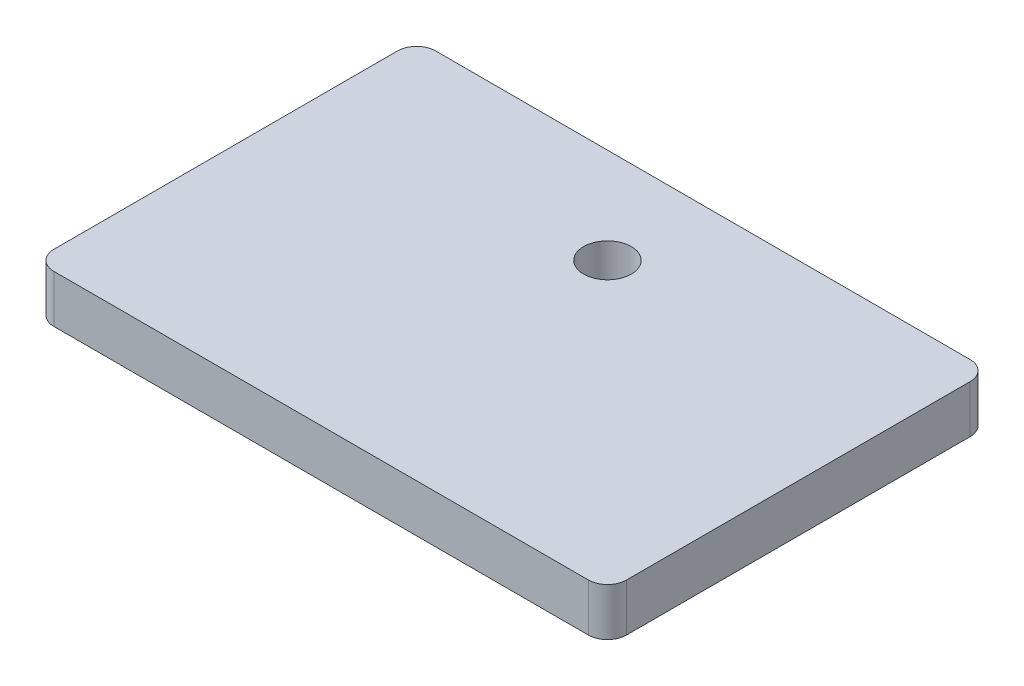
ISO-10303-21;
HEADER;
FILE_DESCRIPTION(('STEP AP214'),'2;1');
FILE_NAME('part.step','',(''),(''),'','','');
FILE_SCHEMA(('AUTOMOTIVE_DESIGN { 1 0 10303 214 1 1 1 1 }'));
ENDSEC;
DATA;
#1=APPLICATION_CONTEXT('core data for automotive mechanical design processes');
#2=APPLICATION_PROTOCOL_DEFINITION('international standard','automotive_design',2000,#1);
#3=PRODUCT_CONTEXT('',#1,'mechanical');
#4=PRODUCT('Part','Part','',(#3));
#5=PRODUCT_RELATED_PRODUCT_CATEGORY('part','',(#4));
#6=PRODUCT_DEFINITION_FORMATION('','',#4);
#7=PRODUCT_DEFINITION_CONTEXT('part definition',#1,'design');
#8=PRODUCT_DEFINITION('design','',#6,#7);
#9=PRODUCT_DEFINITION_SHAPE('','',#8);
#10=(LENGTH_UNIT() NAMED_UNIT(*) SI_UNIT(.MILLI.,.METRE.));
#11=(NAMED_UNIT(*) PLANE_ANGLE_UNIT() SI_UNIT($,.RADIAN.));
#12=(NAMED_UNIT(*) SI_UNIT($,.STERADIAN.) SOLID_ANGLE_UNIT());
#13=UNCERTAINTY_MEASURE_WITH_UNIT(LENGTH_MEASURE(1.E-05),#10,'distance_accuracy_value','');
#14=(GEOMETRIC_REPRESENTATION_CONTEXT(3) GLOBAL_UNCERTAINTY_ASSIGNED_CONTEXT((#13)) GLOBAL_UNIT_ASSIGNED_CONTEXT((#10,
#11,#12)) REPRESENTATION_CONTEXT('',''));
#15=CARTESIAN_POINT('',(0.,0.,0.));
#16=DIRECTION('',(0.,0.,1.));
#17=DIRECTION('',(1.,0.,0.));
#18=AXIS2_PLACEMENT_3D('',#15,#16,#17);
#19=CARTESIAN_POINT('',(38.1,6.35,25.4));
#20=DIRECTION('',(-1.,0.,0.));
#21=DIRECTION('',(0.,0.,1.));
#22=AXIS2_PLACEMENT_3D('',#19,#20,#21);
#23=PLANE('',#22);
#24=DIRECTION('',(0.,0.,-1.));
#25=VECTOR('',#24,1.);
#26=CARTESIAN_POINT('',(38.1,0.,25.4));
#27=LINE('',#26,#25);
#28=CARTESIAN_POINT('',(38.1,0.,22.86));
#29=VERTEX_POINT('',#28);
#30=CARTESIAN_POINT('',(38.1,0.,-22.86));
#31=VERTEX_POINT('',#30);
#32=EDGE_CURVE('E139',#29,#31,#27,.T.);
#33=ORIENTED_EDGE('',*,*,#32,.T.);
#34=DIRECTION('',(0.,-1.,0.));
#35=VECTOR('',#34,1.);
#36=CARTESIAN_POINT('',(38.1,6.35,-22.86));
#37=LINE('',#36,#35);
#38=CARTESIAN_POINT('',(38.1,6.35,-22.86));
#39=VERTEX_POINT('',#38);
#40=EDGE_CURVE('E173',#31,#39,#37,.F.);
#41=ORIENTED_EDGE('',*,*,#40,.T.);
#42=DIRECTION('',(0.,0.,-1.));
#43=VECTOR('',#42,1.);
#44=CARTESIAN_POINT('',(38.1,6.35,25.4));
#45=LINE('',#44,#43);
#46=CARTESIAN_POINT('',(38.1,6.35,22.86));
#47=VERTEX_POINT('',#46);
#48=EDGE_CURVE('E137',#47,#39,#45,.T.);
#49=ORIENTED_EDGE('',*,*,#48,.F.);
#50=DIRECTION('',(0.,-1.,0.));
#51=VECTOR('',#50,1.);
#52=CARTESIAN_POINT('',(38.1,6.35,22.86));
#53=LINE('',#52,#51);
#54=EDGE_CURVE('E169',#47,#29,#53,.T.);
#55=ORIENTED_EDGE('',*,*,#54,.T.);
#56=EDGE_LOOP('',(#33,#41,#49,#55));
#57=FACE_BOUND('',#56,.T.);
#58=ADVANCED_FACE('F38',(#57),#23,.F.);
#59=CARTESIAN_POINT('',(-38.1,6.35,-25.4));
#60=DIRECTION('',(0.,0.,1.));
#61=DIRECTION('',(1.,0.,0.));
#62=AXIS2_PLACEMENT_3D('',#59,#60,#61);
#63=PLANE('',#62);
#64=DIRECTION('',(-1.,0.,0.));
#65=VECTOR('',#64,1.);
#66=CARTESIAN_POINT('',(-38.1,0.,-25.4));
#67=LINE('',#66,#65);
#68=CARTESIAN_POINT('',(35.56,0.,-25.4));
#69=VERTEX_POINT('',#68);
#70=CARTESIAN_POINT('',(-35.56,0.,-25.4));
#71=VERTEX_POINT('',#70);
#72=EDGE_CURVE('E133',#69,#71,#67,.T.);
#73=ORIENTED_EDGE('',*,*,#72,.T.);
#74=DIRECTION('',(0.,-1.,0.));
#75=VECTOR('',#74,1.);
#76=CARTESIAN_POINT('',(-35.56,6.35,-25.4));
#77=LINE('',#76,#75);
#78=CARTESIAN_POINT('',(-35.56,6.35,-25.4));
#79=VERTEX_POINT('',#78);
#80=EDGE_CURVE('E109',#71,#79,#77,.F.);
#81=ORIENTED_EDGE('',*,*,#80,.T.);
#82=DIRECTION('',(-1.,0.,0.));
#83=VECTOR('',#82,1.);
#84=CARTESIAN_POINT('',(-38.1,6.35,-25.4));
#85=LINE('',#84,#83);
#86=CARTESIAN_POINT('',(35.56,6.35,-25.4));
#87=VERTEX_POINT('',#86);
#88=EDGE_CURVE('E192',#87,#79,#85,.T.);
#89=ORIENTED_EDGE('',*,*,#88,.F.);
#90=DIRECTION('',(0.,-1.,0.));
#91=VECTOR('',#90,1.);
#92=CARTESIAN_POINT('',(35.56,6.35,-25.4));
#93=LINE('',#92,#91);
#94=EDGE_CURVE('E115',#87,#69,#93,.T.);
#95=ORIENTED_EDGE('',*,*,#94,.T.);
#96=EDGE_LOOP('',(#73,#81,#89,#95));
#97=FACE_BOUND('',#96,.T.);
#98=ADVANCED_FACE('F222',(#97),#63,.F.);
#99=CARTESIAN_POINT('',(-38.1,6.35,25.4));
#100=DIRECTION('',(1.,0.,0.));
#101=DIRECTION('',(0.,0.,-1.));
#102=AXIS2_PLACEMENT_3D('',#99,#100,#101);
#103=PLANE('',#102);
#104=DIRECTION('',(0.,0.,1.));
#105=VECTOR('',#104,1.);
#106=CARTESIAN_POINT('',(-38.1,6.35,25.4));
#107=LINE('',#106,#105);
#108=CARTESIAN_POINT('',(-38.1,6.35,-22.86));
#109=VERTEX_POINT('',#108);
#110=CARTESIAN_POINT('',(-38.1,6.35,22.86));
#111=VERTEX_POINT('',#110);
#112=EDGE_CURVE('E124',#109,#111,#107,.T.);
#113=ORIENTED_EDGE('',*,*,#112,.F.);
#114=DIRECTION('',(0.,-1.,0.));
#115=VECTOR('',#114,1.);
#116=CARTESIAN_POINT('',(-38.1,6.35,-22.86));
#117=LINE('',#116,#115);
#118=CARTESIAN_POINT('',(-38.1,0.,-22.86));
#119=VERTEX_POINT('',#118);
#120=EDGE_CURVE('E108',#109,#119,#117,.T.);
#121=ORIENTED_EDGE('',*,*,#120,.T.);
#122=DIRECTION('',(0.,0.,1.));
#123=VECTOR('',#122,1.);
#124=CARTESIAN_POINT('',(-38.1,0.,25.4));
#125=LINE('',#124,#123);
#126=CARTESIAN_POINT('',(-38.1,0.,22.86));
#127=VERTEX_POINT('',#126);
#128=EDGE_CURVE('E122',#119,#127,#125,.T.);
#129=ORIENTED_EDGE('',*,*,#128,.T.);
#130=DIRECTION('',(0.,-1.,0.));
#131=VECTOR('',#130,1.);
#132=CARTESIAN_POINT('',(-38.1,6.35,22.86));
#133=LINE('',#132,#131);
#134=EDGE_CURVE('E127',#127,#111,#133,.F.);
#135=ORIENTED_EDGE('',*,*,#134,.T.);
#136=EDGE_LOOP('',(#113,#121,#129,#135));
#137=FACE_BOUND('',#136,.T.);
#138=ADVANCED_FACE('F121',(#137),#103,.F.);
#139=CARTESIAN_POINT('',(-38.1,6.35,25.4));
#140=DIRECTION('',(0.,0.,-1.));
#141=DIRECTION('',(-1.,0.,0.));
#142=AXIS2_PLACEMENT_3D('',#139,#140,#141);
#143=PLANE('',#142);
#144=DIRECTION('',(1.,0.,0.));
#145=VECTOR('',#144,1.);
#146=CARTESIAN_POINT('',(-38.1,0.,25.4));
#147=LINE('',#146,#145);
#148=CARTESIAN_POINT('',(-35.56,0.,25.4));
#149=VERTEX_POINT('',#148);
#150=CARTESIAN_POINT('',(35.56,0.,25.4));
#151=VERTEX_POINT('',#150);
#152=EDGE_CURVE('E132',#149,#151,#147,.T.);
#153=ORIENTED_EDGE('',*,*,#152,.T.);
#154=DIRECTION('',(0.,-1.,0.));
#155=VECTOR('',#154,1.);
#156=CARTESIAN_POINT('',(35.56,6.35,25.4));
#157=LINE('',#156,#155);
#158=CARTESIAN_POINT('',(35.56,6.35,25.4));
#159=VERTEX_POINT('',#158);
#160=EDGE_CURVE('E11',#151,#159,#157,.F.);
#161=ORIENTED_EDGE('',*,*,#160,.T.);
#162=DIRECTION('',(1.,0.,0.));
#163=VECTOR('',#162,1.);
#164=CARTESIAN_POINT('',(-38.1,6.35,25.4));
#165=LINE('',#164,#163);
#166=CARTESIAN_POINT('',(-35.56,6.35,25.4));
#167=VERTEX_POINT('',#166);
#168=EDGE_CURVE('E144',#167,#159,#165,.T.);
#169=ORIENTED_EDGE('',*,*,#168,.F.);
#170=DIRECTION('',(0.,-1.,0.));
#171=VECTOR('',#170,1.);
#172=CARTESIAN_POINT('',(-35.56,6.35,25.4));
#173=LINE('',#172,#171);
#174=EDGE_CURVE('E47',#167,#149,#173,.T.);
#175=ORIENTED_EDGE('',*,*,#174,.T.);
#176=EDGE_LOOP('',(#153,#161,#169,#175));
#177=FACE_BOUND('',#176,.T.);
#178=ADVANCED_FACE('F178',(#177),#143,.F.);
#179=CARTESIAN_POINT('',(0.,6.35,0.));
#180=DIRECTION('',(0.,-1.,0.));
#181=DIRECTION('',(0.,0.,-1.));
#182=AXIS2_PLACEMENT_3D('',#179,#180,#181);
#183=PLANE('',#182);
#184=CARTESIAN_POINT('',(0.,6.35,-12.7));
#185=DIRECTION('',(0.,1.,0.));
#186=DIRECTION('',(0.,0.,1.));
#187=AXIS2_PLACEMENT_3D('',#184,#185,#186);
#188=CIRCLE('',#187,3.175);
#189=CARTESIAN_POINT('',(0.,6.35,-9.52500000000001));
#190=VERTEX_POINT('',#189);
#191=EDGE_CURVE('E198',#190,#190,#188,.T.);
#192=ORIENTED_EDGE('',*,*,#191,.F.);
#193=EDGE_LOOP('',(#192));
#194=FACE_BOUND('',#193,.T.);
#195=ORIENTED_EDGE('',*,*,#88,.T.);
#196=CARTESIAN_POINT('',(-35.56,6.35,-22.86));
#197=DIRECTION('',(0.,-1.,0.));
#198=DIRECTION('',(0.,0.,-1.));
#199=AXIS2_PLACEMENT_3D('',#196,#197,#198);
#200=CIRCLE('',#199,2.54);
#201=EDGE_CURVE('E166',#79,#109,#200,.F.);
#202=ORIENTED_EDGE('',*,*,#201,.T.);
#203=ORIENTED_EDGE('',*,*,#112,.T.);
#204=CARTESIAN_POINT('',(-35.56,6.35,22.86));
#205=DIRECTION('',(0.,-1.,0.));
#206=DIRECTION('',(0.,0.,-1.));
#207=AXIS2_PLACEMENT_3D('',#204,#205,#206);
#208=CIRCLE('',#207,2.54);
#209=EDGE_CURVE('E59',#111,#167,#208,.F.);
#210=ORIENTED_EDGE('',*,*,#209,.T.);
#211=ORIENTED_EDGE('',*,*,#168,.T.);
#212=CARTESIAN_POINT('',(35.56,6.35,22.86));
#213=DIRECTION('',(0.,-1.,0.));
#214=DIRECTION('',(0.,0.,-1.));
#215=AXIS2_PLACEMENT_3D('',#212,#213,#214);
#216=CIRCLE('',#215,2.54);
#217=EDGE_CURVE('E160',#159,#47,#216,.F.);
#218=ORIENTED_EDGE('',*,*,#217,.T.);
#219=ORIENTED_EDGE('',*,*,#48,.T.);
#220=CARTESIAN_POINT('',(35.56,6.35,-22.86));
#221=DIRECTION('',(0.,-1.,0.));
#222=DIRECTION('',(0.,0.,-1.));
#223=AXIS2_PLACEMENT_3D('',#220,#221,#222);
#224=CIRCLE('',#223,2.54);
#225=EDGE_CURVE('E163',#39,#87,#224,.F.);
#226=ORIENTED_EDGE('',*,*,#225,.T.);
#227=EDGE_LOOP('',(#195,#202,#203,#210,#211,#218,#219,#226));
#228=FACE_BOUND('',#227,.T.);
#229=ADVANCED_FACE('F216',(#194,#228),#183,.F.);
#230=CARTESIAN_POINT('',(0.,0.,0.));
#231=DIRECTION('',(0.,-1.,0.));
#232=DIRECTION('',(0.,0.,-1.));
#233=AXIS2_PLACEMENT_3D('',#230,#231,#232);
#234=PLANE('',#233);
#235=CARTESIAN_POINT('',(0.,0.,-12.7));
#236=DIRECTION('',(0.,1.,0.));
#237=DIRECTION('',(0.,0.,1.));
#238=AXIS2_PLACEMENT_3D('',#235,#236,#237);
#239=CIRCLE('',#238,3.175);
#240=CARTESIAN_POINT('',(0.,0.,-9.52500000000001));
#241=VERTEX_POINT('',#240);
#242=EDGE_CURVE('E205',#241,#241,#239,.T.);
#243=ORIENTED_EDGE('',*,*,#242,.T.);
#244=EDGE_LOOP('',(#243));
#245=FACE_BOUND('',#244,.T.);
#246=ORIENTED_EDGE('',*,*,#128,.F.);
#247=CARTESIAN_POINT('',(-35.56,0.,-22.86));
#248=DIRECTION('',(0.,-1.,0.));
#249=DIRECTION('',(0.,0.,-1.));
#250=AXIS2_PLACEMENT_3D('',#247,#248,#249);
#251=CIRCLE('',#250,2.54);
#252=EDGE_CURVE('E104',#119,#71,#251,.T.);
#253=ORIENTED_EDGE('',*,*,#252,.T.);
#254=ORIENTED_EDGE('',*,*,#72,.F.);
#255=CARTESIAN_POINT('',(35.56,0.,-22.86));
#256=DIRECTION('',(0.,-1.,0.));
#257=DIRECTION('',(0.,0.,-1.));
#258=AXIS2_PLACEMENT_3D('',#255,#256,#257);
#259=CIRCLE('',#258,2.54);
#260=EDGE_CURVE('E116',#69,#31,#259,.T.);
#261=ORIENTED_EDGE('',*,*,#260,.T.);
#262=ORIENTED_EDGE('',*,*,#32,.F.);
#263=CARTESIAN_POINT('',(35.56,0.,22.86));
#264=DIRECTION('',(0.,-1.,0.));
#265=DIRECTION('',(0.,0.,-1.));
#266=AXIS2_PLACEMENT_3D('',#263,#264,#265);
#267=CIRCLE('',#266,2.54);
#268=EDGE_CURVE('E148',#29,#151,#267,.T.);
#269=ORIENTED_EDGE('',*,*,#268,.T.);
#270=ORIENTED_EDGE('',*,*,#152,.F.);
#271=CARTESIAN_POINT('',(-35.56,0.,22.86));
#272=DIRECTION('',(0.,-1.,0.));
#273=DIRECTION('',(0.,0.,-1.));
#274=AXIS2_PLACEMENT_3D('',#271,#272,#273);
#275=CIRCLE('',#274,2.54);
#276=EDGE_CURVE('E126',#149,#127,#275,.T.);
#277=ORIENTED_EDGE('',*,*,#276,.T.);
#278=EDGE_LOOP('',(#246,#253,#254,#261,#262,#269,#270,#277));
#279=FACE_BOUND('',#278,.T.);
#280=ADVANCED_FACE('F129',(#245,#279),#234,.T.);
#281=CARTESIAN_POINT('',(-35.56,6.35,-22.86));
#282=DIRECTION('',(0.,-1.,0.));
#283=DIRECTION('',(0.,0.,-1.));
#284=AXIS2_PLACEMENT_3D('',#281,#282,#283);
#285=CYLINDRICAL_SURFACE('',#284,2.54);
#286=ORIENTED_EDGE('',*,*,#201,.F.);
#287=ORIENTED_EDGE('',*,*,#80,.F.);
#288=ORIENTED_EDGE('',*,*,#252,.F.);
#289=ORIENTED_EDGE('',*,*,#120,.F.);
#290=EDGE_LOOP('',(#286,#287,#288,#289));
#291=FACE_BOUND('',#290,.T.);
#292=ADVANCED_FACE('F107',(#291),#285,.T.);
#293=CARTESIAN_POINT('',(35.56,6.35,-22.86));
#294=DIRECTION('',(0.,-1.,0.));
#295=DIRECTION('',(0.,0.,-1.));
#296=AXIS2_PLACEMENT_3D('',#293,#294,#295);
#297=CYLINDRICAL_SURFACE('',#296,2.54);
#298=ORIENTED_EDGE('',*,*,#225,.F.);
#299=ORIENTED_EDGE('',*,*,#40,.F.);
#300=ORIENTED_EDGE('',*,*,#260,.F.);
#301=ORIENTED_EDGE('',*,*,#94,.F.);
#302=EDGE_LOOP('',(#298,#299,#300,#301));
#303=FACE_BOUND('',#302,.T.);
#304=ADVANCED_FACE('F224',(#303),#297,.T.);
#305=CARTESIAN_POINT('',(35.56,6.35,22.86));
#306=DIRECTION('',(0.,-1.,0.));
#307=DIRECTION('',(0.,0.,-1.));
#308=AXIS2_PLACEMENT_3D('',#305,#306,#307);
#309=CYLINDRICAL_SURFACE('',#308,2.54);
#310=ORIENTED_EDGE('',*,*,#217,.F.);
#311=ORIENTED_EDGE('',*,*,#160,.F.);
#312=ORIENTED_EDGE('',*,*,#268,.F.);
#313=ORIENTED_EDGE('',*,*,#54,.F.);
#314=EDGE_LOOP('',(#310,#311,#312,#313));
#315=FACE_BOUND('',#314,.T.);
#316=ADVANCED_FACE('F185',(#315),#309,.T.);
#317=CARTESIAN_POINT('',(-35.56,6.35,22.86));
#318=DIRECTION('',(0.,-1.,0.));
#319=DIRECTION('',(0.,0.,-1.));
#320=AXIS2_PLACEMENT_3D('',#317,#318,#319);
#321=CYLINDRICAL_SURFACE('',#320,2.54);
#322=ORIENTED_EDGE('',*,*,#209,.F.);
#323=ORIENTED_EDGE('',*,*,#134,.F.);
#324=ORIENTED_EDGE('',*,*,#276,.F.);
#325=ORIENTED_EDGE('',*,*,#174,.F.);
#326=EDGE_LOOP('',(#322,#323,#324,#325));
#327=FACE_BOUND('',#326,.T.);
#328=ADVANCED_FACE('F40',(#327),#321,.T.);
#329=CARTESIAN_POINT('',(0.,0.,-12.7));
#330=DIRECTION('',(0.,1.,0.));
#331=DIRECTION('',(0.,0.,1.));
#332=AXIS2_PLACEMENT_3D('',#329,#330,#331);
#333=CYLINDRICAL_SURFACE('',#332,3.175);
#334=ORIENTED_EDGE('',*,*,#242,.F.);
#335=EDGE_LOOP('',(#334));
#336=FACE_BOUND('',#335,.T.);
#337=ORIENTED_EDGE('',*,*,#191,.T.);
#338=EDGE_LOOP('',(#337));
#339=FACE_BOUND('',#338,.T.);
#340=ADVANCED_FACE('F214',(#336,#339),#333,.F.);
#341=CLOSED_SHELL('',(#58,#98,#138,#178,#229,#280,#292,#304,#316,#328,#340));
#342=MANIFOLD_SOLID_BREP('B2',#341);
#343=ADVANCED_BREP_SHAPE_REPRESENTATION('',(#18,#342),#14);
#344=SHAPE_DEFINITION_REPRESENTATION(#9,#343);
ENDSEC;
END-ISO-10303-21;
